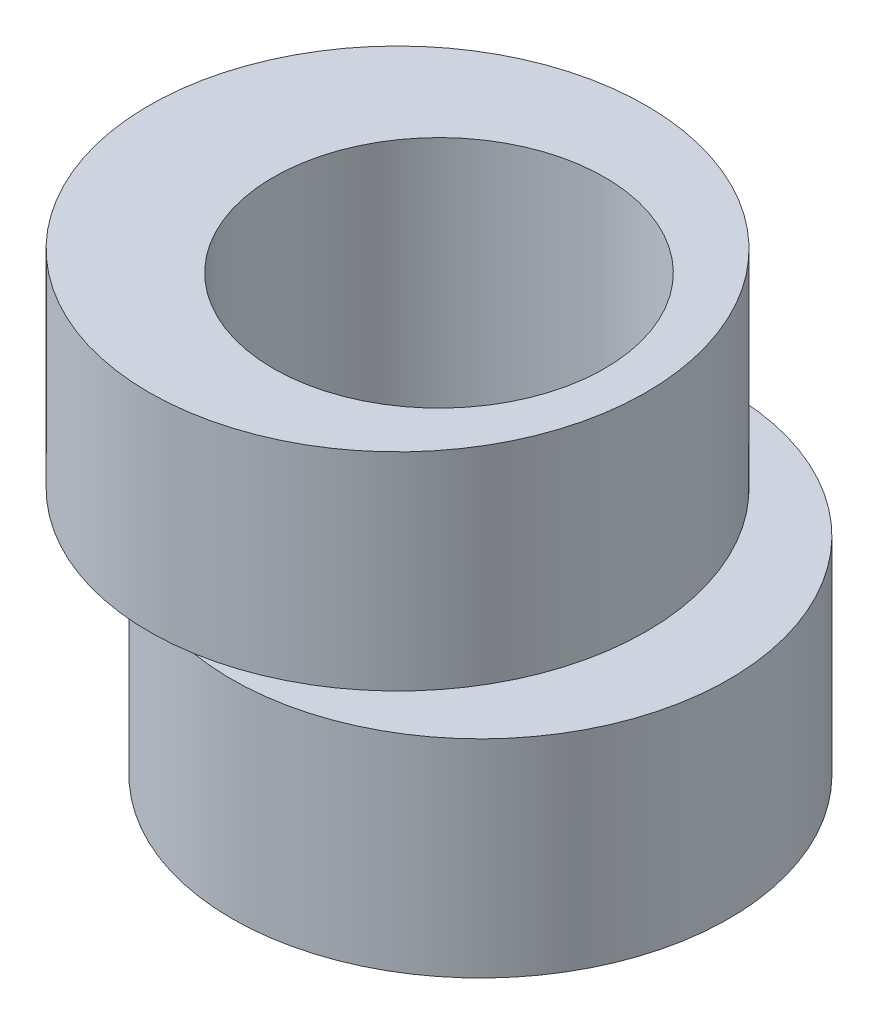
ISO-10303-21;
HEADER;
FILE_DESCRIPTION(('STEP AP214'),'2;1');
FILE_NAME('part.step','',(''),(''),'','','');
FILE_SCHEMA(('AUTOMOTIVE_DESIGN { 1 0 10303 214 1 1 1 1 }'));
ENDSEC;
DATA;
#1=APPLICATION_CONTEXT('core data for automotive mechanical design processes');
#2=APPLICATION_PROTOCOL_DEFINITION('international standard','automotive_design',2000,#1);
#3=PRODUCT_CONTEXT('',#1,'mechanical');
#4=PRODUCT('Part','Part','',(#3));
#5=PRODUCT_RELATED_PRODUCT_CATEGORY('part','',(#4));
#6=PRODUCT_DEFINITION_FORMATION('','',#4);
#7=PRODUCT_DEFINITION_CONTEXT('part definition',#1,'design');
#8=PRODUCT_DEFINITION('design','',#6,#7);
#9=PRODUCT_DEFINITION_SHAPE('','',#8);
#10=(LENGTH_UNIT() NAMED_UNIT(*) SI_UNIT(.MILLI.,.METRE.));
#11=(NAMED_UNIT(*) PLANE_ANGLE_UNIT() SI_UNIT($,.RADIAN.));
#12=(NAMED_UNIT(*) SI_UNIT($,.STERADIAN.) SOLID_ANGLE_UNIT());
#13=UNCERTAINTY_MEASURE_WITH_UNIT(LENGTH_MEASURE(1.E-05),#10,'distance_accuracy_value','');
#14=(GEOMETRIC_REPRESENTATION_CONTEXT(3) GLOBAL_UNCERTAINTY_ASSIGNED_CONTEXT((#13)) GLOBAL_UNIT_ASSIGNED_CONTEXT((#10,
#11,#12)) REPRESENTATION_CONTEXT('',''));
#15=CARTESIAN_POINT('',(0.,0.,0.));
#16=DIRECTION('',(0.,0.,1.));
#17=DIRECTION('',(1.,0.,0.));
#18=AXIS2_PLACEMENT_3D('',#15,#16,#17);
#19=CARTESIAN_POINT('',(1.,5.,0.));
#20=DIRECTION('',(0.,1.,0.));
#21=DIRECTION('',(0.,0.,1.));
#22=AXIS2_PLACEMENT_3D('',#19,#20,#21);
#23=PLANE('',#22);
#24=CARTESIAN_POINT('',(-1.,5.,0.));
#25=DIRECTION('',(0.,1.,0.));
#26=DIRECTION('',(0.,0.,1.));
#27=AXIS2_PLACEMENT_3D('',#24,#25,#26);
#28=CIRCLE('',#27,6.);
#29=CARTESIAN_POINT('',(0.,5.,5.91607978309962));
#30=VERTEX_POINT('',#29);
#31=CARTESIAN_POINT('',(0.,5.,-5.91607978309962));
#32=VERTEX_POINT('',#31);
#33=EDGE_CURVE('E49',#30,#32,#28,.T.);
#34=ORIENTED_EDGE('',*,*,#33,.F.);
#35=CARTESIAN_POINT('',(1.,5.,0.));
#36=DIRECTION('',(0.,1.,0.));
#37=DIRECTION('',(0.,0.,1.));
#38=AXIS2_PLACEMENT_3D('',#35,#36,#37);
#39=CIRCLE('',#38,6.);
#40=EDGE_CURVE('E43',#30,#32,#39,.T.);
#41=ORIENTED_EDGE('',*,*,#40,.T.);
#42=EDGE_LOOP('',(#34,#41));
#43=FACE_BOUND('',#42,.T.);
#44=ADVANCED_FACE('F34',(#43),#23,.T.);
#45=CARTESIAN_POINT('',(1.,0.,0.));
#46=DIRECTION('',(0.,1.,0.));
#47=DIRECTION('',(0.,0.,1.));
#48=AXIS2_PLACEMENT_3D('',#45,#46,#47);
#49=PLANE('',#48);
#50=CARTESIAN_POINT('',(1.,0.,0.));
#51=DIRECTION('',(0.,1.,0.));
#52=DIRECTION('',(0.,0.,1.));
#53=AXIS2_PLACEMENT_3D('',#50,#51,#52);
#54=CIRCLE('',#53,6.);
#55=CARTESIAN_POINT('',(1.,0.,6.));
#56=VERTEX_POINT('',#55);
#57=EDGE_CURVE('E38',#56,#56,#54,.T.);
#58=ORIENTED_EDGE('',*,*,#57,.F.);
#59=EDGE_LOOP('',(#58));
#60=FACE_BOUND('',#59,.T.);
#61=CARTESIAN_POINT('',(0.,0.,0.));
#62=DIRECTION('',(0.,1.,0.));
#63=DIRECTION('',(0.,0.,1.));
#64=AXIS2_PLACEMENT_3D('',#61,#62,#63);
#65=CIRCLE('',#64,4.);
#66=CARTESIAN_POINT('',(0.,0.,4.));
#67=VERTEX_POINT('',#66);
#68=EDGE_CURVE('E65',#67,#67,#65,.T.);
#69=ORIENTED_EDGE('',*,*,#68,.T.);
#70=EDGE_LOOP('',(#69));
#71=FACE_BOUND('',#70,.T.);
#72=ADVANCED_FACE('F75',(#60,#71),#49,.F.);
#73=CARTESIAN_POINT('',(1.,5.,0.));
#74=DIRECTION('',(0.,-1.,0.));
#75=DIRECTION('',(0.,0.,-1.));
#76=AXIS2_PLACEMENT_3D('',#73,#74,#75);
#77=CYLINDRICAL_SURFACE('',#76,6.);
#78=EDGE_CURVE('E11',#32,#30,#39,.T.);
#79=ORIENTED_EDGE('',*,*,#78,.F.);
#80=ORIENTED_EDGE('',*,*,#40,.F.);
#81=EDGE_LOOP('',(#79,#80));
#82=FACE_BOUND('',#81,.T.);
#83=ORIENTED_EDGE('',*,*,#57,.T.);
#84=EDGE_LOOP('',(#83));
#85=FACE_BOUND('',#84,.T.);
#86=ADVANCED_FACE('F36',(#82,#85),#77,.T.);
#87=CARTESIAN_POINT('',(0.,5.,0.));
#88=DIRECTION('',(0.,-1.,0.));
#89=DIRECTION('',(0.,0.,-1.));
#90=AXIS2_PLACEMENT_3D('',#87,#88,#89);
#91=CYLINDRICAL_SURFACE('',#90,4.);
#92=ORIENTED_EDGE('',*,*,#68,.F.);
#93=EDGE_LOOP('',(#92));
#94=FACE_BOUND('',#93,.T.);
#95=CARTESIAN_POINT('',(0.,10.,0.));
#96=DIRECTION('',(0.,1.,0.));
#97=DIRECTION('',(0.,0.,1.));
#98=AXIS2_PLACEMENT_3D('',#95,#96,#97);
#99=CIRCLE('',#98,4.);
#100=CARTESIAN_POINT('',(0.,10.,4.));
#101=VERTEX_POINT('',#100);
#102=EDGE_CURVE('E60',#101,#101,#99,.T.);
#103=ORIENTED_EDGE('',*,*,#102,.T.);
#104=EDGE_LOOP('',(#103));
#105=FACE_BOUND('',#104,.T.);
#106=ADVANCED_FACE('F81',(#94,#105),#91,.F.);
#107=CARTESIAN_POINT('',(-1.,5.,0.));
#108=DIRECTION('',(0.,1.,0.));
#109=DIRECTION('',(0.,0.,1.));
#110=AXIS2_PLACEMENT_3D('',#107,#108,#109);
#111=PLANE('',#110);
#112=EDGE_CURVE('E57',#32,#30,#28,.T.);
#113=ORIENTED_EDGE('',*,*,#112,.F.);
#114=ORIENTED_EDGE('',*,*,#78,.T.);
#115=EDGE_LOOP('',(#113,#114));
#116=FACE_BOUND('',#115,.T.);
#117=ADVANCED_FACE('F58',(#116),#111,.F.);
#118=CARTESIAN_POINT('',(-1.,10.,0.));
#119=DIRECTION('',(0.,1.,0.));
#120=DIRECTION('',(0.,0.,1.));
#121=AXIS2_PLACEMENT_3D('',#118,#119,#120);
#122=PLANE('',#121);
#123=CARTESIAN_POINT('',(-1.,10.,0.));
#124=DIRECTION('',(0.,1.,0.));
#125=DIRECTION('',(0.,0.,1.));
#126=AXIS2_PLACEMENT_3D('',#123,#124,#125);
#127=CIRCLE('',#126,6.);
#128=CARTESIAN_POINT('',(-1.,10.,6.));
#129=VERTEX_POINT('',#128);
#130=EDGE_CURVE('E63',#129,#129,#127,.T.);
#131=ORIENTED_EDGE('',*,*,#130,.T.);
#132=EDGE_LOOP('',(#131));
#133=FACE_BOUND('',#132,.T.);
#134=ORIENTED_EDGE('',*,*,#102,.F.);
#135=EDGE_LOOP('',(#134));
#136=FACE_BOUND('',#135,.T.);
#137=ADVANCED_FACE('F89',(#133,#136),#122,.T.);
#138=CARTESIAN_POINT('',(-1.,10.,0.));
#139=DIRECTION('',(0.,-1.,0.));
#140=DIRECTION('',(0.,0.,-1.));
#141=AXIS2_PLACEMENT_3D('',#138,#139,#140);
#142=CYLINDRICAL_SURFACE('',#141,6.);
#143=ORIENTED_EDGE('',*,*,#130,.F.);
#144=EDGE_LOOP('',(#143));
#145=FACE_BOUND('',#144,.T.);
#146=ORIENTED_EDGE('',*,*,#33,.T.);
#147=ORIENTED_EDGE('',*,*,#112,.T.);
#148=EDGE_LOOP('',(#146,#147));
#149=FACE_BOUND('',#148,.T.);
#150=ADVANCED_FACE('F62',(#145,#149),#142,.T.);
#151=CLOSED_SHELL('',(#44,#72,#86,#106,#117,#137,#150));
#152=MANIFOLD_SOLID_BREP('B2',#151);
#153=ADVANCED_BREP_SHAPE_REPRESENTATION('',(#18,#152),#14);
#154=SHAPE_DEFINITION_REPRESENTATION(#9,#153);
ENDSEC;
END-ISO-10303-21;
